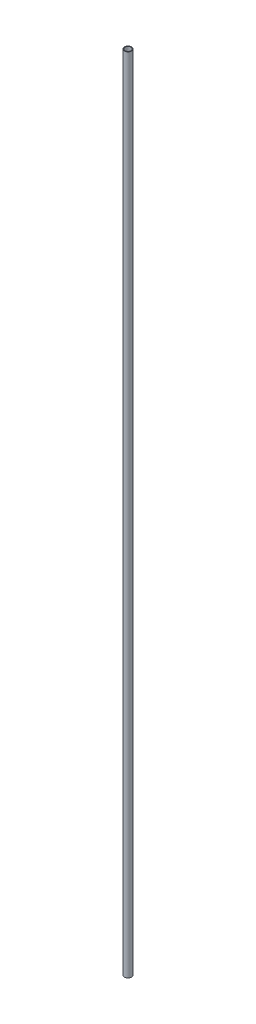
ISO-10303-21;
HEADER;
FILE_DESCRIPTION(('STEP AP214'),'2;1');
FILE_NAME('part.step','',(''),(''),'','','');
FILE_SCHEMA(('AUTOMOTIVE_DESIGN { 1 0 10303 214 1 1 1 1 }'));
ENDSEC;
DATA;
#1=APPLICATION_CONTEXT('core data for automotive mechanical design processes');
#2=APPLICATION_PROTOCOL_DEFINITION('international standard','automotive_design',2000,#1);
#3=PRODUCT_CONTEXT('',#1,'mechanical');
#4=PRODUCT('Part','Part','',(#3));
#5=PRODUCT_RELATED_PRODUCT_CATEGORY('part','',(#4));
#6=PRODUCT_DEFINITION_FORMATION('','',#4);
#7=PRODUCT_DEFINITION_CONTEXT('part definition',#1,'design');
#8=PRODUCT_DEFINITION('design','',#6,#7);
#9=PRODUCT_DEFINITION_SHAPE('','',#8);
#10=(LENGTH_UNIT() NAMED_UNIT(*) SI_UNIT(.MILLI.,.METRE.));
#11=(NAMED_UNIT(*) PLANE_ANGLE_UNIT() SI_UNIT($,.RADIAN.));
#12=(NAMED_UNIT(*) SI_UNIT($,.STERADIAN.) SOLID_ANGLE_UNIT());
#13=UNCERTAINTY_MEASURE_WITH_UNIT(LENGTH_MEASURE(1.E-05),#10,'distance_accuracy_value','');
#14=(GEOMETRIC_REPRESENTATION_CONTEXT(3) GLOBAL_UNCERTAINTY_ASSIGNED_CONTEXT((#13)) GLOBAL_UNIT_ASSIGNED_CONTEXT((#10,
#11,#12)) REPRESENTATION_CONTEXT('',''));
#15=CARTESIAN_POINT('',(0.,0.,0.));
#16=DIRECTION('',(0.,0.,1.));
#17=DIRECTION('',(1.,0.,0.));
#18=AXIS2_PLACEMENT_3D('',#15,#16,#17);
#19=CARTESIAN_POINT('',(0.,1419.5,0.));
#20=DIRECTION('',(0.,1.,0.));
#21=DIRECTION('',(0.,0.,1.));
#22=AXIS2_PLACEMENT_3D('',#19,#20,#21);
#23=PLANE('',#22);
#24=CARTESIAN_POINT('',(0.,1419.5,0.));
#25=DIRECTION('',(0.,1.,0.));
#26=DIRECTION('',(0.,0.,1.));
#27=AXIS2_PLACEMENT_3D('',#24,#25,#26);
#28=CIRCLE('',#27,6.35);
#29=CARTESIAN_POINT('',(0.,1419.5,6.35));
#30=VERTEX_POINT('',#29);
#31=EDGE_CURVE('E10',#30,#30,#28,.T.);
#32=ORIENTED_EDGE('',*,*,#31,.T.);
#33=EDGE_LOOP('',(#32));
#34=FACE_BOUND('',#33,.T.);
#35=CARTESIAN_POINT('',(0.,1419.5,0.));
#36=DIRECTION('',(0.,1.,0.));
#37=DIRECTION('',(0.,0.,1.));
#38=AXIS2_PLACEMENT_3D('',#35,#36,#37);
#39=CIRCLE('',#38,5.35);
#40=CARTESIAN_POINT('',(0.,1419.5,5.35));
#41=VERTEX_POINT('',#40);
#42=EDGE_CURVE('E42',#41,#41,#39,.T.);
#43=ORIENTED_EDGE('',*,*,#42,.F.);
#44=EDGE_LOOP('',(#43));
#45=FACE_BOUND('',#44,.T.);
#46=ADVANCED_FACE('F31',(#34,#45),#23,.T.);
#47=CARTESIAN_POINT('',(0.,0.,0.));
#48=DIRECTION('',(0.,1.,0.));
#49=DIRECTION('',(0.,0.,1.));
#50=AXIS2_PLACEMENT_3D('',#47,#48,#49);
#51=PLANE('',#50);
#52=CARTESIAN_POINT('',(0.,0.,0.));
#53=DIRECTION('',(0.,1.,0.));
#54=DIRECTION('',(0.,0.,1.));
#55=AXIS2_PLACEMENT_3D('',#52,#53,#54);
#56=CIRCLE('',#55,6.35);
#57=CARTESIAN_POINT('',(0.,0.,6.35));
#58=VERTEX_POINT('',#57);
#59=EDGE_CURVE('E35',#58,#58,#56,.T.);
#60=ORIENTED_EDGE('',*,*,#59,.F.);
#61=EDGE_LOOP('',(#60));
#62=FACE_BOUND('',#61,.T.);
#63=CARTESIAN_POINT('',(0.,0.,0.));
#64=DIRECTION('',(0.,1.,0.));
#65=DIRECTION('',(0.,0.,1.));
#66=AXIS2_PLACEMENT_3D('',#63,#64,#65);
#67=CIRCLE('',#66,5.35);
#68=CARTESIAN_POINT('',(0.,0.,5.35));
#69=VERTEX_POINT('',#68);
#70=EDGE_CURVE('E44',#69,#69,#67,.T.);
#71=ORIENTED_EDGE('',*,*,#70,.T.);
#72=EDGE_LOOP('',(#71));
#73=FACE_BOUND('',#72,.T.);
#74=ADVANCED_FACE('F54',(#62,#73),#51,.F.);
#75=CARTESIAN_POINT('',(0.,1419.5,0.));
#76=DIRECTION('',(0.,-1.,0.));
#77=DIRECTION('',(0.,0.,-1.));
#78=AXIS2_PLACEMENT_3D('',#75,#76,#77);
#79=CYLINDRICAL_SURFACE('',#78,6.35);
#80=ORIENTED_EDGE('',*,*,#31,.F.);
#81=EDGE_LOOP('',(#80));
#82=FACE_BOUND('',#81,.T.);
#83=ORIENTED_EDGE('',*,*,#59,.T.);
#84=EDGE_LOOP('',(#83));
#85=FACE_BOUND('',#84,.T.);
#86=ADVANCED_FACE('F33',(#82,#85),#79,.T.);
#87=CARTESIAN_POINT('',(0.,1419.5,0.));
#88=DIRECTION('',(0.,-1.,0.));
#89=DIRECTION('',(0.,0.,-1.));
#90=AXIS2_PLACEMENT_3D('',#87,#88,#89);
#91=CYLINDRICAL_SURFACE('',#90,5.35);
#92=ORIENTED_EDGE('',*,*,#42,.T.);
#93=EDGE_LOOP('',(#92));
#94=FACE_BOUND('',#93,.T.);
#95=ORIENTED_EDGE('',*,*,#70,.F.);
#96=EDGE_LOOP('',(#95));
#97=FACE_BOUND('',#96,.T.);
#98=ADVANCED_FACE('F50',(#94,#97),#91,.F.);
#99=CLOSED_SHELL('',(#46,#74,#86,#98));
#100=MANIFOLD_SOLID_BREP('B2',#99);
#101=ADVANCED_BREP_SHAPE_REPRESENTATION('',(#18,#100),#14);
#102=SHAPE_DEFINITION_REPRESENTATION(#9,#101);
ENDSEC;
END-ISO-10303-21;
